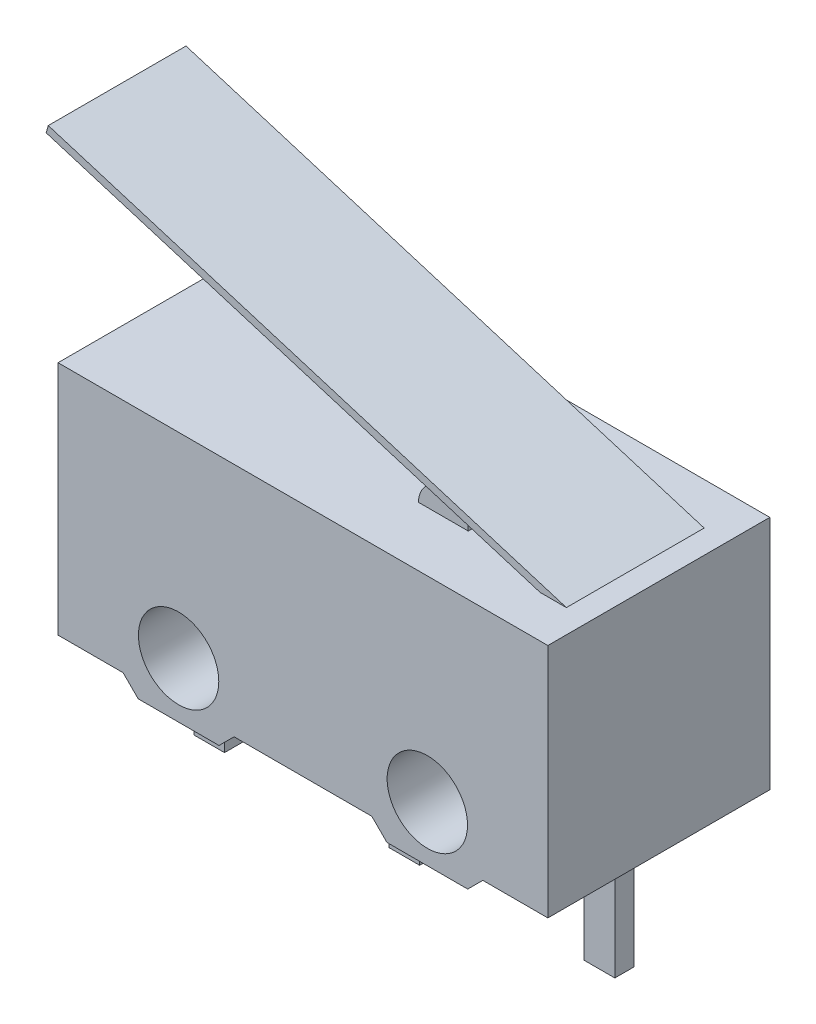
ISO-10303-21;
HEADER;
FILE_DESCRIPTION(('STEP AP214'),'2;1');
FILE_NAME('part.step','',(''),(''),'','','');
FILE_SCHEMA(('AUTOMOTIVE_DESIGN { 1 0 10303 214 1 1 1 1 }'));
ENDSEC;
DATA;
#1=APPLICATION_CONTEXT('core data for automotive mechanical design processes');
#2=APPLICATION_PROTOCOL_DEFINITION('international standard','automotive_design',2000,#1);
#3=PRODUCT_CONTEXT('',#1,'mechanical');
#4=PRODUCT('Part','Part','',(#3));
#5=PRODUCT_RELATED_PRODUCT_CATEGORY('part','',(#4));
#6=PRODUCT_DEFINITION_FORMATION('','',#4);
#7=PRODUCT_DEFINITION_CONTEXT('part definition',#1,'design');
#8=PRODUCT_DEFINITION('design','',#6,#7);
#9=PRODUCT_DEFINITION_SHAPE('','',#8);
#10=(LENGTH_UNIT() NAMED_UNIT(*) SI_UNIT(.MILLI.,.METRE.));
#11=(NAMED_UNIT(*) PLANE_ANGLE_UNIT() SI_UNIT($,.RADIAN.));
#12=(NAMED_UNIT(*) SI_UNIT($,.STERADIAN.) SOLID_ANGLE_UNIT());
#13=UNCERTAINTY_MEASURE_WITH_UNIT(LENGTH_MEASURE(1.E-05),#10,'distance_accuracy_value','');
#14=(GEOMETRIC_REPRESENTATION_CONTEXT(3) GLOBAL_UNCERTAINTY_ASSIGNED_CONTEXT((#13)) GLOBAL_UNIT_ASSIGNED_CONTEXT((#10,
#11,#12)) REPRESENTATION_CONTEXT('',''));
#15=CARTESIAN_POINT('',(0.,0.,0.));
#16=DIRECTION('',(0.,0.,1.));
#17=DIRECTION('',(1.,0.,0.));
#18=AXIS2_PLACEMENT_3D('',#15,#16,#17);
#19=CARTESIAN_POINT('',(0.,6.16570318150763,2.9));
#20=DIRECTION('',(0.,1.,0.));
#21=DIRECTION('',(0.,0.,1.));
#22=AXIS2_PLACEMENT_3D('',#19,#20,#21);
#23=PLANE('',#22);
#24=DIRECTION('',(1.,0.,0.));
#25=VECTOR('',#24,1.);
#26=CARTESIAN_POINT('',(1.47,6.16570318150763,1.35));
#27=LINE('',#26,#25);
#28=CARTESIAN_POINT('',(1.47,6.16570318150763,1.35));
#29=VERTEX_POINT('',#28);
#30=CARTESIAN_POINT('',(2.77,6.16570318150763,1.35));
#31=VERTEX_POINT('',#30);
#32=EDGE_CURVE('E419',#29,#31,#27,.T.);
#33=ORIENTED_EDGE('',*,*,#32,.F.);
#34=DIRECTION('',(0.,0.,-1.));
#35=VECTOR('',#34,1.);
#36=CARTESIAN_POINT('',(1.47,6.16570318150763,1.35));
#37=LINE('',#36,#35);
#38=CARTESIAN_POINT('',(1.47,6.16570318150763,-1.35));
#39=VERTEX_POINT('',#38);
#40=EDGE_CURVE('E433',#29,#39,#37,.T.);
#41=ORIENTED_EDGE('',*,*,#40,.T.);
#42=DIRECTION('',(1.,0.,0.));
#43=VECTOR('',#42,1.);
#44=CARTESIAN_POINT('',(1.47,6.16570318150763,-1.35));
#45=LINE('',#44,#43);
#46=CARTESIAN_POINT('',(2.77,6.16570318150763,-1.35));
#47=VERTEX_POINT('',#46);
#48=EDGE_CURVE('E420',#39,#47,#45,.T.);
#49=ORIENTED_EDGE('',*,*,#48,.T.);
#50=DIRECTION('',(0.,0.,-1.));
#51=VECTOR('',#50,1.);
#52=CARTESIAN_POINT('',(2.77,6.16570318150763,1.35));
#53=LINE('',#52,#51);
#54=EDGE_CURVE('E423',#31,#47,#53,.T.);
#55=ORIENTED_EDGE('',*,*,#54,.F.);
#56=EDGE_LOOP('',(#33,#41,#49,#55));
#57=FACE_BOUND('',#56,.T.);
#58=DIRECTION('',(1.,0.,0.));
#59=VECTOR('',#58,1.);
#60=CARTESIAN_POINT('',(0.,6.16570318150763,-2.9));
#61=LINE('',#60,#59);
#62=CARTESIAN_POINT('',(-6.4,6.16570318150763,-2.9));
#63=VERTEX_POINT('',#62);
#64=CARTESIAN_POINT('',(6.4,6.16570318150763,-2.9));
#65=VERTEX_POINT('',#64);
#66=EDGE_CURVE('E511',#63,#65,#61,.T.);
#67=ORIENTED_EDGE('',*,*,#66,.F.);
#68=DIRECTION('',(0.,0.,-1.));
#69=VECTOR('',#68,1.);
#70=CARTESIAN_POINT('',(-6.4,6.16570318150763,2.9));
#71=LINE('',#70,#69);
#72=CARTESIAN_POINT('',(-6.4,6.16570318150763,2.9));
#73=VERTEX_POINT('',#72);
#74=EDGE_CURVE('E558',#73,#63,#71,.T.);
#75=ORIENTED_EDGE('',*,*,#74,.F.);
#76=DIRECTION('',(1.,0.,0.));
#77=VECTOR('',#76,1.);
#78=CARTESIAN_POINT('',(0.,6.16570318150763,2.9));
#79=LINE('',#78,#77);
#80=CARTESIAN_POINT('',(6.4,6.16570318150763,2.9));
#81=VERTEX_POINT('',#80);
#82=EDGE_CURVE('E458',#73,#81,#79,.T.);
#83=ORIENTED_EDGE('',*,*,#82,.T.);
#84=DIRECTION('',(0.,0.,-1.));
#85=VECTOR('',#84,1.);
#86=CARTESIAN_POINT('',(6.4,6.16570318150763,2.9));
#87=LINE('',#86,#85);
#88=EDGE_CURVE('E561',#81,#65,#87,.T.);
#89=ORIENTED_EDGE('',*,*,#88,.T.);
#90=EDGE_LOOP('',(#67,#75,#83,#89));
#91=FACE_BOUND('',#90,.T.);
#92=DIRECTION('',(0.,0.,-1.));
#93=VECTOR('',#92,1.);
#94=CARTESIAN_POINT('',(5.78406072396667,6.16570318150763,1.8));
#95=LINE('',#94,#93);
#96=CARTESIAN_POINT('',(5.78406072396667,6.16570318150763,1.8));
#97=VERTEX_POINT('',#96);
#98=CARTESIAN_POINT('',(5.78406072396667,6.16570318150763,-1.8));
#99=VERTEX_POINT('',#98);
#100=EDGE_CURVE('E66',#97,#99,#95,.T.);
#101=ORIENTED_EDGE('',*,*,#100,.F.);
#102=DIRECTION('',(1.,0.,0.));
#103=VECTOR('',#102,1.);
#104=CARTESIAN_POINT('',(5.1,6.16570318150763,1.8));
#105=LINE('',#104,#103);
#106=CARTESIAN_POINT('',(5.1,6.16570318150763,1.8));
#107=VERTEX_POINT('',#106);
#108=EDGE_CURVE('E61',#107,#97,#105,.T.);
#109=ORIENTED_EDGE('',*,*,#108,.F.);
#110=DIRECTION('',(0.,0.,-1.));
#111=VECTOR('',#110,1.);
#112=CARTESIAN_POINT('',(5.1,6.16570318150763,1.8));
#113=LINE('',#112,#111);
#114=CARTESIAN_POINT('',(5.1,6.16570318150763,-1.8));
#115=VERTEX_POINT('',#114);
#116=EDGE_CURVE('E263',#107,#115,#113,.T.);
#117=ORIENTED_EDGE('',*,*,#116,.T.);
#118=DIRECTION('',(1.,0.,0.));
#119=VECTOR('',#118,1.);
#120=CARTESIAN_POINT('',(5.1,6.16570318150763,-1.8));
#121=LINE('',#120,#119);
#122=EDGE_CURVE('E265',#115,#99,#121,.T.);
#123=ORIENTED_EDGE('',*,*,#122,.T.);
#124=EDGE_LOOP('',(#101,#109,#117,#123));
#125=FACE_BOUND('',#124,.T.);
#126=ADVANCED_FACE('F45',(#57,#91,#125),#23,.T.);
#127=CARTESIAN_POINT('',(0.,0.,2.9));
#128=DIRECTION('',(0.,-1.,0.));
#129=DIRECTION('',(1.,0.,0.));
#130=AXIS2_PLACEMENT_3D('',#127,#128,#129);
#131=PLANE('',#130);
#132=DIRECTION('',(0.,0.,-1.));
#133=VECTOR('',#132,1.);
#134=CARTESIAN_POINT('',(-5.5,0.,0.25));
#135=LINE('',#134,#133);
#136=CARTESIAN_POINT('',(-5.5,0.,0.25));
#137=VERTEX_POINT('',#136);
#138=CARTESIAN_POINT('',(-5.5,0.,-0.25));
#139=VERTEX_POINT('',#138);
#140=EDGE_CURVE('E293',#137,#139,#135,.T.);
#141=ORIENTED_EDGE('',*,*,#140,.F.);
#142=DIRECTION('',(-1.,0.,0.));
#143=VECTOR('',#142,1.);
#144=CARTESIAN_POINT('',(-5.5,0.,0.25));
#145=LINE('',#144,#143);
#146=CARTESIAN_POINT('',(-4.7,0.,0.25));
#147=VERTEX_POINT('',#146);
#148=EDGE_CURVE('E325',#147,#137,#145,.T.);
#149=ORIENTED_EDGE('',*,*,#148,.F.);
#150=DIRECTION('',(0.,0.,-1.));
#151=VECTOR('',#150,1.);
#152=CARTESIAN_POINT('',(-4.7,0.,2.9));
#153=LINE('',#152,#151);
#154=CARTESIAN_POINT('',(-4.7,0.,2.9));
#155=VERTEX_POINT('',#154);
#156=EDGE_CURVE('E551',#155,#147,#153,.T.);
#157=ORIENTED_EDGE('',*,*,#156,.F.);
#158=DIRECTION('',(-1.,0.,0.));
#159=VECTOR('',#158,1.);
#160=CARTESIAN_POINT('',(0.,0.,2.9));
#161=LINE('',#160,#159);
#162=CARTESIAN_POINT('',(-6.4,0.,2.9));
#163=VERTEX_POINT('',#162);
#164=EDGE_CURVE('E466',#155,#163,#161,.T.);
#165=ORIENTED_EDGE('',*,*,#164,.T.);
#166=DIRECTION('',(0.,0.,-1.));
#167=VECTOR('',#166,1.);
#168=CARTESIAN_POINT('',(-6.4,0.,2.9));
#169=LINE('',#168,#167);
#170=CARTESIAN_POINT('',(-6.4,0.,-2.9));
#171=VERTEX_POINT('',#170);
#172=EDGE_CURVE('E555',#163,#171,#169,.T.);
#173=ORIENTED_EDGE('',*,*,#172,.T.);
#174=DIRECTION('',(-1.,0.,0.));
#175=VECTOR('',#174,1.);
#176=CARTESIAN_POINT('',(0.,0.,-2.9));
#177=LINE('',#176,#175);
#178=CARTESIAN_POINT('',(-4.7,0.,-2.9));
#179=VERTEX_POINT('',#178);
#180=EDGE_CURVE('E519',#179,#171,#177,.T.);
#181=ORIENTED_EDGE('',*,*,#180,.F.);
#182=CARTESIAN_POINT('',(-4.7,0.,-0.25));
#183=VERTEX_POINT('',#182);
#184=EDGE_CURVE('E550',#183,#179,#153,.T.);
#185=ORIENTED_EDGE('',*,*,#184,.F.);
#186=DIRECTION('',(-1.,0.,0.));
#187=VECTOR('',#186,1.);
#188=CARTESIAN_POINT('',(-5.5,0.,-0.25));
#189=LINE('',#188,#187);
#190=EDGE_CURVE('E312',#183,#139,#189,.T.);
#191=ORIENTED_EDGE('',*,*,#190,.T.);
#192=EDGE_LOOP('',(#141,#149,#157,#165,#173,#181,#185,#191));
#193=FACE_BOUND('',#192,.T.);
#194=ADVANCED_FACE('F626',(#193),#131,.T.);
#195=CARTESIAN_POINT('',(0.,0.,2.9));
#196=DIRECTION('',(0.,-1.,0.));
#197=DIRECTION('',(0.,0.,-1.));
#198=AXIS2_PLACEMENT_3D('',#195,#196,#197);
#199=PLANE('',#198);
#200=DIRECTION('',(-1.,0.,0.));
#201=VECTOR('',#200,1.);
#202=CARTESIAN_POINT('',(0.,0.,-2.9));
#203=LINE('',#202,#201);
#204=CARTESIAN_POINT('',(1.8,0.,-2.9));
#205=VERTEX_POINT('',#204);
#206=CARTESIAN_POINT('',(-1.8,0.,-2.9));
#207=VERTEX_POINT('',#206);
#208=EDGE_CURVE('E437',#205,#207,#203,.T.);
#209=ORIENTED_EDGE('',*,*,#208,.F.);
#210=DIRECTION('',(0.,0.,-1.));
#211=VECTOR('',#210,1.);
#212=CARTESIAN_POINT('',(1.8,0.,2.9));
#213=LINE('',#212,#211);
#214=CARTESIAN_POINT('',(1.8,0.,2.9));
#215=VERTEX_POINT('',#214);
#216=EDGE_CURVE('E11',#215,#205,#213,.T.);
#217=ORIENTED_EDGE('',*,*,#216,.F.);
#218=DIRECTION('',(-1.,0.,0.));
#219=VECTOR('',#218,1.);
#220=CARTESIAN_POINT('',(0.,0.,2.9));
#221=LINE('',#220,#219);
#222=CARTESIAN_POINT('',(-1.8,0.,2.9));
#223=VERTEX_POINT('',#222);
#224=EDGE_CURVE('E438',#215,#223,#221,.T.);
#225=ORIENTED_EDGE('',*,*,#224,.T.);
#226=DIRECTION('',(0.,0.,-1.));
#227=VECTOR('',#226,1.);
#228=CARTESIAN_POINT('',(-1.8,0.,2.9));
#229=LINE('',#228,#227);
#230=EDGE_CURVE('E490',#223,#207,#229,.T.);
#231=ORIENTED_EDGE('',*,*,#230,.T.);
#232=EDGE_LOOP('',(#209,#217,#225,#231));
#233=FACE_BOUND('',#232,.T.);
#234=DIRECTION('',(0.,0.,-1.));
#235=VECTOR('',#234,1.);
#236=CARTESIAN_POINT('',(-0.4,0.,0.25));
#237=LINE('',#236,#235);
#238=CARTESIAN_POINT('',(-0.4,0.,0.25));
#239=VERTEX_POINT('',#238);
#240=CARTESIAN_POINT('',(-0.4,0.,-0.25));
#241=VERTEX_POINT('',#240);
#242=EDGE_CURVE('E319',#239,#241,#237,.T.);
#243=ORIENTED_EDGE('',*,*,#242,.F.);
#244=DIRECTION('',(-1.,0.,0.));
#245=VECTOR('',#244,1.);
#246=CARTESIAN_POINT('',(-0.4,0.,0.25));
#247=LINE('',#246,#245);
#248=CARTESIAN_POINT('',(0.4,0.,0.25));
#249=VERTEX_POINT('',#248);
#250=EDGE_CURVE('E350',#249,#239,#247,.T.);
#251=ORIENTED_EDGE('',*,*,#250,.F.);
#252=DIRECTION('',(0.,0.,-1.));
#253=VECTOR('',#252,1.);
#254=CARTESIAN_POINT('',(0.4,0.,0.25));
#255=LINE('',#254,#253);
#256=CARTESIAN_POINT('',(0.4,0.,-0.25));
#257=VERTEX_POINT('',#256);
#258=EDGE_CURVE('E341',#249,#257,#255,.T.);
#259=ORIENTED_EDGE('',*,*,#258,.T.);
#260=DIRECTION('',(-1.,0.,0.));
#261=VECTOR('',#260,1.);
#262=CARTESIAN_POINT('',(-0.4,0.,-0.25));
#263=LINE('',#262,#261);
#264=EDGE_CURVE('E356',#257,#241,#263,.T.);
#265=ORIENTED_EDGE('',*,*,#264,.T.);
#266=EDGE_LOOP('',(#243,#251,#259,#265));
#267=FACE_BOUND('',#266,.T.);
#268=ADVANCED_FACE('F47',(#233,#267),#199,.T.);
#269=CARTESIAN_POINT('',(0.900000000000015,0.9,2.9));
#270=DIRECTION('',(0.707106781186553,0.707106781186542,0.));
#271=DIRECTION('',(-0.707106781186542,0.707106781186553,0.));
#272=AXIS2_PLACEMENT_3D('',#269,#270,#271);
#273=PLANE('',#272);
#274=DIRECTION('',(0.707106781186542,-0.707106781186553,0.));
#275=VECTOR('',#274,1.);
#276=CARTESIAN_POINT('',(0.900000000000015,0.9,-2.9));
#277=LINE('',#276,#275);
#278=CARTESIAN_POINT('',(2.19429681849237,-0.394296818492372,-2.9));
#279=VERTEX_POINT('',#278);
#280=EDGE_CURVE('E494',#205,#279,#277,.T.);
#281=ORIENTED_EDGE('',*,*,#280,.T.);
#282=DIRECTION('',(0.,0.,-1.));
#283=VECTOR('',#282,1.);
#284=CARTESIAN_POINT('',(2.19429681849237,-0.394296818492372,2.9));
#285=LINE('',#284,#283);
#286=CARTESIAN_POINT('',(2.19429681849237,-0.394296818492372,2.9));
#287=VERTEX_POINT('',#286);
#288=EDGE_CURVE('E54',#287,#279,#285,.T.);
#289=ORIENTED_EDGE('',*,*,#288,.F.);
#290=DIRECTION('',(0.707106781186542,-0.707106781186553,0.));
#291=VECTOR('',#290,1.);
#292=CARTESIAN_POINT('',(0.900000000000015,0.9,2.9));
#293=LINE('',#292,#291);
#294=EDGE_CURVE('E442',#215,#287,#293,.T.);
#295=ORIENTED_EDGE('',*,*,#294,.F.);
#296=ORIENTED_EDGE('',*,*,#216,.T.);
#297=EDGE_LOOP('',(#281,#289,#295,#296));
#298=FACE_BOUND('',#297,.T.);
#299=ADVANCED_FACE('F606',(#298),#273,.F.);
#300=CARTESIAN_POINT('',(0.,-0.394296818492372,2.9));
#301=DIRECTION('',(0.,1.,0.));
#302=DIRECTION('',(0.,0.,1.));
#303=AXIS2_PLACEMENT_3D('',#300,#301,#302);
#304=PLANE('',#303);
#305=DIRECTION('',(1.,0.,0.));
#306=VECTOR('',#305,1.);
#307=CARTESIAN_POINT('',(0.,-0.394296818492372,-2.9));
#308=LINE('',#307,#306);
#309=CARTESIAN_POINT('',(4.30570318150763,-0.394296818492371,-2.9));
#310=VERTEX_POINT('',#309);
#311=EDGE_CURVE('E497',#279,#310,#308,.T.);
#312=ORIENTED_EDGE('',*,*,#311,.T.);
#313=DIRECTION('',(0.,0.,-1.));
#314=VECTOR('',#313,1.);
#315=CARTESIAN_POINT('',(4.30570318150763,-0.394296818492371,2.9));
#316=LINE('',#315,#314);
#317=CARTESIAN_POINT('',(4.30570318150763,-0.394296818492371,2.9));
#318=VERTEX_POINT('',#317);
#319=EDGE_CURVE('E573',#318,#310,#316,.T.);
#320=ORIENTED_EDGE('',*,*,#319,.F.);
#321=DIRECTION('',(1.,0.,0.));
#322=VECTOR('',#321,1.);
#323=CARTESIAN_POINT('',(0.,-0.394296818492372,2.9));
#324=LINE('',#323,#322);
#325=EDGE_CURVE('E446',#287,#318,#324,.T.);
#326=ORIENTED_EDGE('',*,*,#325,.F.);
#327=ORIENTED_EDGE('',*,*,#288,.T.);
#328=EDGE_LOOP('',(#312,#320,#326,#327));
#329=FACE_BOUND('',#328,.T.);
#330=ADVANCED_FACE('F582',(#329),#304,.F.);
#331=CARTESIAN_POINT('',(2.35000000000004,-2.35,2.9));
#332=DIRECTION('',(-0.707106781186553,0.707106781186542,0.));
#333=DIRECTION('',(-0.707106781186542,-0.707106781186553,0.));
#334=AXIS2_PLACEMENT_3D('',#331,#332,#333);
#335=PLANE('',#334);
#336=DIRECTION('',(0.707106781186542,0.707106781186553,0.));
#337=VECTOR('',#336,1.);
#338=CARTESIAN_POINT('',(2.35000000000004,-2.35,-2.9));
#339=LINE('',#338,#337);
#340=CARTESIAN_POINT('',(4.7,0.,-2.9));
#341=VERTEX_POINT('',#340);
#342=EDGE_CURVE('E500',#310,#341,#339,.T.);
#343=ORIENTED_EDGE('',*,*,#342,.T.);
#344=DIRECTION('',(0.,0.,-1.));
#345=VECTOR('',#344,1.);
#346=CARTESIAN_POINT('',(4.7,0.,2.9));
#347=LINE('',#346,#345);
#348=CARTESIAN_POINT('',(4.7,0.,-0.25));
#349=VERTEX_POINT('',#348);
#350=EDGE_CURVE('E568',#349,#341,#347,.T.);
#351=ORIENTED_EDGE('',*,*,#350,.F.);
#352=DIRECTION('',(0.,0.,-1.));
#353=VECTOR('',#352,1.);
#354=CARTESIAN_POINT('',(4.7,0.,0.25));
#355=LINE('',#354,#353);
#356=CARTESIAN_POINT('',(4.7,0.,0.25));
#357=VERTEX_POINT('',#356);
#358=EDGE_CURVE('E388',#357,#349,#355,.T.);
#359=ORIENTED_EDGE('',*,*,#358,.F.);
#360=CARTESIAN_POINT('',(4.7,0.,2.9));
#361=VERTEX_POINT('',#360);
#362=EDGE_CURVE('E569',#361,#357,#347,.T.);
#363=ORIENTED_EDGE('',*,*,#362,.F.);
#364=DIRECTION('',(0.707106781186542,0.707106781186553,0.));
#365=VECTOR('',#364,1.);
#366=CARTESIAN_POINT('',(2.35000000000004,-2.35,2.9));
#367=LINE('',#366,#365);
#368=EDGE_CURVE('E449',#318,#361,#367,.T.);
#369=ORIENTED_EDGE('',*,*,#368,.F.);
#370=ORIENTED_EDGE('',*,*,#319,.T.);
#371=EDGE_LOOP('',(#343,#351,#359,#363,#369,#370));
#372=FACE_BOUND('',#371,.T.);
#373=ADVANCED_FACE('F596',(#372),#335,.F.);
#374=CARTESIAN_POINT('',(0.,0.,2.9));
#375=DIRECTION('',(0.,1.,0.));
#376=DIRECTION('',(-1.,0.,0.));
#377=AXIS2_PLACEMENT_3D('',#374,#375,#376);
#378=PLANE('',#377);
#379=ORIENTED_EDGE('',*,*,#362,.T.);
#380=DIRECTION('',(-1.,0.,0.));
#381=VECTOR('',#380,1.);
#382=CARTESIAN_POINT('',(4.7,0.,0.25));
#383=LINE('',#382,#381);
#384=CARTESIAN_POINT('',(5.5,0.,0.25));
#385=VERTEX_POINT('',#384);
#386=EDGE_CURVE('E384',#385,#357,#383,.T.);
#387=ORIENTED_EDGE('',*,*,#386,.F.);
#388=DIRECTION('',(0.,0.,-1.));
#389=VECTOR('',#388,1.);
#390=CARTESIAN_POINT('',(5.5,0.,0.25));
#391=LINE('',#390,#389);
#392=CARTESIAN_POINT('',(5.5,0.,-0.25));
#393=VERTEX_POINT('',#392);
#394=EDGE_CURVE('E404',#385,#393,#391,.T.);
#395=ORIENTED_EDGE('',*,*,#394,.T.);
#396=DIRECTION('',(-1.,0.,0.));
#397=VECTOR('',#396,1.);
#398=CARTESIAN_POINT('',(4.7,0.,-0.25));
#399=LINE('',#398,#397);
#400=EDGE_CURVE('E377',#393,#349,#399,.T.);
#401=ORIENTED_EDGE('',*,*,#400,.T.);
#402=ORIENTED_EDGE('',*,*,#350,.T.);
#403=DIRECTION('',(1.,0.,0.));
#404=VECTOR('',#403,1.);
#405=CARTESIAN_POINT('',(0.,0.,-2.9));
#406=LINE('',#405,#404);
#407=CARTESIAN_POINT('',(6.4,0.,-2.9));
#408=VERTEX_POINT('',#407);
#409=EDGE_CURVE('E504',#341,#408,#406,.T.);
#410=ORIENTED_EDGE('',*,*,#409,.T.);
#411=DIRECTION('',(0.,0.,-1.));
#412=VECTOR('',#411,1.);
#413=CARTESIAN_POINT('',(6.4,0.,2.9));
#414=LINE('',#413,#412);
#415=CARTESIAN_POINT('',(6.4,0.,2.9));
#416=VERTEX_POINT('',#415);
#417=EDGE_CURVE('E564',#416,#408,#414,.T.);
#418=ORIENTED_EDGE('',*,*,#417,.F.);
#419=DIRECTION('',(1.,0.,0.));
#420=VECTOR('',#419,1.);
#421=CARTESIAN_POINT('',(0.,0.,2.9));
#422=LINE('',#421,#420);
#423=EDGE_CURVE('E452',#361,#416,#422,.T.);
#424=ORIENTED_EDGE('',*,*,#423,.F.);
#425=EDGE_LOOP('',(#379,#387,#395,#401,#402,#410,#418,#424));
#426=FACE_BOUND('',#425,.T.);
#427=ADVANCED_FACE('F640',(#426),#378,.F.);
#428=CARTESIAN_POINT('',(6.4,0.,2.9));
#429=DIRECTION('',(-1.,0.,0.));
#430=DIRECTION('',(0.,0.,1.));
#431=AXIS2_PLACEMENT_3D('',#428,#429,#430);
#432=PLANE('',#431);
#433=DIRECTION('',(0.,1.,0.));
#434=VECTOR('',#433,1.);
#435=CARTESIAN_POINT('',(6.4,0.,-2.9));
#436=LINE('',#435,#434);
#437=EDGE_CURVE('E507',#408,#65,#436,.T.);
#438=ORIENTED_EDGE('',*,*,#437,.T.);
#439=ORIENTED_EDGE('',*,*,#88,.F.);
#440=DIRECTION('',(0.,1.,0.));
#441=VECTOR('',#440,1.);
#442=CARTESIAN_POINT('',(6.4,0.,2.9));
#443=LINE('',#442,#441);
#444=EDGE_CURVE('E455',#416,#81,#443,.T.);
#445=ORIENTED_EDGE('',*,*,#444,.F.);
#446=ORIENTED_EDGE('',*,*,#417,.T.);
#447=EDGE_LOOP('',(#438,#439,#445,#446));
#448=FACE_BOUND('',#447,.T.);
#449=ADVANCED_FACE('F638',(#448),#432,.F.);
#450=CARTESIAN_POINT('',(-6.4,0.,2.9));
#451=DIRECTION('',(-1.,0.,0.));
#452=DIRECTION('',(0.,0.,1.));
#453=AXIS2_PLACEMENT_3D('',#450,#451,#452);
#454=PLANE('',#453);
#455=DIRECTION('',(0.,1.,0.));
#456=VECTOR('',#455,1.);
#457=CARTESIAN_POINT('',(-6.4,0.,-2.9));
#458=LINE('',#457,#456);
#459=EDGE_CURVE('E515',#171,#63,#458,.T.);
#460=ORIENTED_EDGE('',*,*,#459,.F.);
#461=ORIENTED_EDGE('',*,*,#172,.F.);
#462=DIRECTION('',(0.,1.,0.));
#463=VECTOR('',#462,1.);
#464=CARTESIAN_POINT('',(-6.4,0.,2.9));
#465=LINE('',#464,#463);
#466=EDGE_CURVE('E462',#163,#73,#465,.T.);
#467=ORIENTED_EDGE('',*,*,#466,.T.);
#468=ORIENTED_EDGE('',*,*,#74,.T.);
#469=EDGE_LOOP('',(#460,#461,#467,#468));
#470=FACE_BOUND('',#469,.T.);
#471=ADVANCED_FACE('F631',(#470),#454,.T.);
#472=CARTESIAN_POINT('',(-2.35000000000004,-2.35,2.9));
#473=DIRECTION('',(-0.707106781186553,-0.707106781186542,0.));
#474=DIRECTION('',(0.707106781186542,-0.707106781186553,0.));
#475=AXIS2_PLACEMENT_3D('',#472,#473,#474);
#476=PLANE('',#475);
#477=DIRECTION('',(-0.707106781186542,0.707106781186553,0.));
#478=VECTOR('',#477,1.);
#479=CARTESIAN_POINT('',(-2.35000000000004,-2.35,-2.9));
#480=LINE('',#479,#478);
#481=CARTESIAN_POINT('',(-4.30570318150763,-0.394296818492372,-2.9));
#482=VERTEX_POINT('',#481);
#483=EDGE_CURVE('E523',#482,#179,#480,.T.);
#484=ORIENTED_EDGE('',*,*,#483,.F.);
#485=DIRECTION('',(0.,0.,-1.));
#486=VECTOR('',#485,1.);
#487=CARTESIAN_POINT('',(-4.30570318150763,-0.394296818492372,2.9));
#488=LINE('',#487,#486);
#489=CARTESIAN_POINT('',(-4.30570318150763,-0.394296818492372,2.9));
#490=VERTEX_POINT('',#489);
#491=EDGE_CURVE('E547',#490,#482,#488,.T.);
#492=ORIENTED_EDGE('',*,*,#491,.F.);
#493=DIRECTION('',(-0.707106781186542,0.707106781186553,0.));
#494=VECTOR('',#493,1.);
#495=CARTESIAN_POINT('',(-2.35000000000004,-2.35,2.9));
#496=LINE('',#495,#494);
#497=EDGE_CURVE('E470',#490,#155,#496,.T.);
#498=ORIENTED_EDGE('',*,*,#497,.T.);
#499=ORIENTED_EDGE('',*,*,#156,.T.);
#500=DIRECTION('',(0.,0.,-1.));
#501=VECTOR('',#500,1.);
#502=CARTESIAN_POINT('',(-4.7,0.,0.25));
#503=LINE('',#502,#501);
#504=EDGE_CURVE('E285',#147,#183,#503,.T.);
#505=ORIENTED_EDGE('',*,*,#504,.T.);
#506=ORIENTED_EDGE('',*,*,#184,.T.);
#507=EDGE_LOOP('',(#484,#492,#498,#499,#505,#506));
#508=FACE_BOUND('',#507,.T.);
#509=ADVANCED_FACE('F619',(#508),#476,.T.);
#510=CARTESIAN_POINT('',(0.,-0.394296818492372,2.9));
#511=DIRECTION('',(0.,-1.,0.));
#512=DIRECTION('',(0.,0.,-1.));
#513=AXIS2_PLACEMENT_3D('',#510,#511,#512);
#514=PLANE('',#513);
#515=DIRECTION('',(-1.,0.,0.));
#516=VECTOR('',#515,1.);
#517=CARTESIAN_POINT('',(0.,-0.394296818492372,-2.9));
#518=LINE('',#517,#516);
#519=CARTESIAN_POINT('',(-2.19429681849237,-0.394296818492372,-2.9));
#520=VERTEX_POINT('',#519);
#521=EDGE_CURVE('E527',#520,#482,#518,.T.);
#522=ORIENTED_EDGE('',*,*,#521,.F.);
#523=DIRECTION('',(0.,0.,-1.));
#524=VECTOR('',#523,1.);
#525=CARTESIAN_POINT('',(-2.19429681849237,-0.394296818492372,2.9));
#526=LINE('',#525,#524);
#527=CARTESIAN_POINT('',(-2.19429681849237,-0.394296818492372,2.9));
#528=VERTEX_POINT('',#527);
#529=EDGE_CURVE('E544',#528,#520,#526,.T.);
#530=ORIENTED_EDGE('',*,*,#529,.F.);
#531=DIRECTION('',(-1.,0.,0.));
#532=VECTOR('',#531,1.);
#533=CARTESIAN_POINT('',(0.,-0.394296818492372,2.9));
#534=LINE('',#533,#532);
#535=EDGE_CURVE('E474',#528,#490,#534,.T.);
#536=ORIENTED_EDGE('',*,*,#535,.T.);
#537=ORIENTED_EDGE('',*,*,#491,.T.);
#538=EDGE_LOOP('',(#522,#530,#536,#537));
#539=FACE_BOUND('',#538,.T.);
#540=ADVANCED_FACE('F615',(#539),#514,.T.);
#541=CARTESIAN_POINT('',(-3.25,1.05,2.9));
#542=DIRECTION('',(0.,0.,-1.));
#543=DIRECTION('',(-1.,0.,0.));
#544=AXIS2_PLACEMENT_3D('',#541,#542,#543);
#545=CYLINDRICAL_SURFACE('',#544,1.05);
#546=CARTESIAN_POINT('',(-3.25,1.05,2.9));
#547=DIRECTION('',(0.,0.,1.));
#548=DIRECTION('',(1.,0.,0.));
#549=AXIS2_PLACEMENT_3D('',#546,#547,#548);
#550=CIRCLE('',#549,1.05);
#551=CARTESIAN_POINT('',(-2.2,1.05,2.9));
#552=VERTEX_POINT('',#551);
#553=EDGE_CURVE('E482',#552,#552,#550,.T.);
#554=ORIENTED_EDGE('',*,*,#553,.T.);
#555=EDGE_LOOP('',(#554));
#556=FACE_BOUND('',#555,.T.);
#557=CARTESIAN_POINT('',(-3.25,1.05,-2.9));
#558=DIRECTION('',(0.,0.,1.));
#559=DIRECTION('',(1.,0.,0.));
#560=AXIS2_PLACEMENT_3D('',#557,#558,#559);
#561=CIRCLE('',#560,1.05);
#562=CARTESIAN_POINT('',(-2.2,1.05,-2.9));
#563=VERTEX_POINT('',#562);
#564=EDGE_CURVE('E535',#563,#563,#561,.T.);
#565=ORIENTED_EDGE('',*,*,#564,.F.);
#566=EDGE_LOOP('',(#565));
#567=FACE_BOUND('',#566,.T.);
#568=ADVANCED_FACE('F769',(#556,#567),#545,.F.);
#569=CARTESIAN_POINT('',(-0.900000000000015,0.9,2.9));
#570=DIRECTION('',(0.707106781186553,-0.707106781186542,0.));
#571=DIRECTION('',(0.707106781186542,0.707106781186553,0.));
#572=AXIS2_PLACEMENT_3D('',#569,#570,#571);
#573=PLANE('',#572);
#574=DIRECTION('',(-0.707106781186542,-0.707106781186553,0.));
#575=VECTOR('',#574,1.);
#576=CARTESIAN_POINT('',(-0.900000000000015,0.9,-2.9));
#577=LINE('',#576,#575);
#578=EDGE_CURVE('E531',#207,#520,#577,.T.);
#579=ORIENTED_EDGE('',*,*,#578,.F.);
#580=ORIENTED_EDGE('',*,*,#230,.F.);
#581=DIRECTION('',(-0.707106781186542,-0.707106781186553,0.));
#582=VECTOR('',#581,1.);
#583=CARTESIAN_POINT('',(-0.900000000000015,0.9,2.9));
#584=LINE('',#583,#582);
#585=EDGE_CURVE('E478',#223,#528,#584,.T.);
#586=ORIENTED_EDGE('',*,*,#585,.T.);
#587=ORIENTED_EDGE('',*,*,#529,.T.);
#588=EDGE_LOOP('',(#579,#580,#586,#587));
#589=FACE_BOUND('',#588,.T.);
#590=ADVANCED_FACE('F611',(#589),#573,.T.);
#591=CARTESIAN_POINT('',(3.25,1.05,2.9));
#592=DIRECTION('',(0.,0.,-1.));
#593=DIRECTION('',(-1.,0.,0.));
#594=AXIS2_PLACEMENT_3D('',#591,#592,#593);
#595=CYLINDRICAL_SURFACE('',#594,1.05);
#596=CARTESIAN_POINT('',(3.25,1.05,2.9));
#597=DIRECTION('',(0.,0.,1.));
#598=DIRECTION('',(1.,0.,0.));
#599=AXIS2_PLACEMENT_3D('',#596,#597,#598);
#600=CIRCLE('',#599,1.05);
#601=CARTESIAN_POINT('',(4.3,1.05,2.9));
#602=VERTEX_POINT('',#601);
#603=EDGE_CURVE('E486',#602,#602,#600,.F.);
#604=ORIENTED_EDGE('',*,*,#603,.F.);
#605=EDGE_LOOP('',(#604));
#606=FACE_BOUND('',#605,.T.);
#607=CARTESIAN_POINT('',(3.25,1.05,-2.9));
#608=DIRECTION('',(0.,0.,1.));
#609=DIRECTION('',(1.,0.,0.));
#610=AXIS2_PLACEMENT_3D('',#607,#608,#609);
#611=CIRCLE('',#610,1.05);
#612=CARTESIAN_POINT('',(4.3,1.05,-2.9));
#613=VERTEX_POINT('',#612);
#614=EDGE_CURVE('E443',#613,#613,#611,.F.);
#615=ORIENTED_EDGE('',*,*,#614,.T.);
#616=EDGE_LOOP('',(#615));
#617=FACE_BOUND('',#616,.T.);
#618=ADVANCED_FACE('F749',(#606,#617),#595,.F.);
#619=CARTESIAN_POINT('',(0.,0.,2.9));
#620=DIRECTION('',(0.,0.,1.));
#621=DIRECTION('',(1.,0.,0.));
#622=AXIS2_PLACEMENT_3D('',#619,#620,#621);
#623=PLANE('',#622);
#624=ORIENTED_EDGE('',*,*,#224,.F.);
#625=ORIENTED_EDGE('',*,*,#294,.T.);
#626=ORIENTED_EDGE('',*,*,#325,.T.);
#627=ORIENTED_EDGE('',*,*,#368,.T.);
#628=ORIENTED_EDGE('',*,*,#423,.T.);
#629=ORIENTED_EDGE('',*,*,#444,.T.);
#630=ORIENTED_EDGE('',*,*,#82,.F.);
#631=ORIENTED_EDGE('',*,*,#466,.F.);
#632=ORIENTED_EDGE('',*,*,#164,.F.);
#633=ORIENTED_EDGE('',*,*,#497,.F.);
#634=ORIENTED_EDGE('',*,*,#535,.F.);
#635=ORIENTED_EDGE('',*,*,#585,.F.);
#636=EDGE_LOOP('',(#624,#625,#626,#627,#628,#629,#630,#631,#632,#633,#634,#635));
#637=FACE_BOUND('',#636,.T.);
#638=ORIENTED_EDGE('',*,*,#553,.F.);
#639=EDGE_LOOP('',(#638));
#640=FACE_BOUND('',#639,.T.);
#641=ORIENTED_EDGE('',*,*,#603,.T.);
#642=EDGE_LOOP('',(#641));
#643=FACE_BOUND('',#642,.T.);
#644=ADVANCED_FACE('F602',(#637,#640,#643),#623,.T.);
#645=CARTESIAN_POINT('',(0.,0.,-2.9));
#646=DIRECTION('',(0.,0.,1.));
#647=DIRECTION('',(1.,0.,0.));
#648=AXIS2_PLACEMENT_3D('',#645,#646,#647);
#649=PLANE('',#648);
#650=ORIENTED_EDGE('',*,*,#208,.T.);
#651=ORIENTED_EDGE('',*,*,#578,.T.);
#652=ORIENTED_EDGE('',*,*,#521,.T.);
#653=ORIENTED_EDGE('',*,*,#483,.T.);
#654=ORIENTED_EDGE('',*,*,#180,.T.);
#655=ORIENTED_EDGE('',*,*,#459,.T.);
#656=ORIENTED_EDGE('',*,*,#66,.T.);
#657=ORIENTED_EDGE('',*,*,#437,.F.);
#658=ORIENTED_EDGE('',*,*,#409,.F.);
#659=ORIENTED_EDGE('',*,*,#342,.F.);
#660=ORIENTED_EDGE('',*,*,#311,.F.);
#661=ORIENTED_EDGE('',*,*,#280,.F.);
#662=EDGE_LOOP('',(#650,#651,#652,#653,#654,#655,#656,#657,#658,#659,#660,#661));
#663=FACE_BOUND('',#662,.T.);
#664=ORIENTED_EDGE('',*,*,#564,.T.);
#665=EDGE_LOOP('',(#664));
#666=FACE_BOUND('',#665,.T.);
#667=ORIENTED_EDGE('',*,*,#614,.F.);
#668=EDGE_LOOP('',(#667));
#669=FACE_BOUND('',#668,.T.);
#670=ADVANCED_FACE('F589',(#663,#666,#669),#649,.F.);
#671=CARTESIAN_POINT('',(2.12,6.16570318150763,1.35));
#672=DIRECTION('',(0.,0.,-1.));
#673=DIRECTION('',(-1.,0.,0.));
#674=AXIS2_PLACEMENT_3D('',#671,#672,#673);
#675=CYLINDRICAL_SURFACE('',#674,0.65);
#676=CARTESIAN_POINT('',(2.12,6.16570318150763,-1.35));
#677=DIRECTION('',(0.,0.,1.));
#678=DIRECTION('',(1.,0.,0.));
#679=AXIS2_PLACEMENT_3D('',#676,#677,#678);
#680=CIRCLE('',#679,0.65);
#681=EDGE_CURVE('E415',#47,#39,#680,.T.);
#682=ORIENTED_EDGE('',*,*,#681,.T.);
#683=ORIENTED_EDGE('',*,*,#40,.F.);
#684=CARTESIAN_POINT('',(2.12,6.16570318150763,1.35));
#685=DIRECTION('',(0.,0.,1.));
#686=DIRECTION('',(1.,0.,0.));
#687=AXIS2_PLACEMENT_3D('',#684,#685,#686);
#688=CIRCLE('',#687,0.65);
#689=EDGE_CURVE('E416',#31,#29,#688,.T.);
#690=ORIENTED_EDGE('',*,*,#689,.F.);
#691=ORIENTED_EDGE('',*,*,#54,.T.);
#692=EDGE_LOOP('',(#682,#683,#690,#691));
#693=FACE_BOUND('',#692,.T.);
#694=ADVANCED_FACE('F719',(#693),#675,.T.);
#695=CARTESIAN_POINT('',(2.12,6.16570318150763,1.35));
#696=DIRECTION('',(0.,0.,1.));
#697=DIRECTION('',(1.,0.,0.));
#698=AXIS2_PLACEMENT_3D('',#695,#696,#697);
#699=PLANE('',#698);
#700=ORIENTED_EDGE('',*,*,#689,.T.);
#701=ORIENTED_EDGE('',*,*,#32,.T.);
#702=EDGE_LOOP('',(#700,#701));
#703=FACE_BOUND('',#702,.T.);
#704=ADVANCED_FACE('F707',(#703),#699,.T.);
#705=CARTESIAN_POINT('',(2.12,6.16570318150763,-1.35));
#706=DIRECTION('',(0.,0.,1.));
#707=DIRECTION('',(1.,0.,0.));
#708=AXIS2_PLACEMENT_3D('',#705,#706,#707);
#709=PLANE('',#708);
#710=ORIENTED_EDGE('',*,*,#681,.F.);
#711=ORIENTED_EDGE('',*,*,#48,.F.);
#712=EDGE_LOOP('',(#710,#711));
#713=FACE_BOUND('',#712,.T.);
#714=ADVANCED_FACE('F667',(#713),#709,.F.);
#715=CARTESIAN_POINT('',(4.7,0.,0.25));
#716=DIRECTION('',(1.,0.,0.));
#717=DIRECTION('',(0.,0.,-1.));
#718=AXIS2_PLACEMENT_3D('',#715,#716,#717);
#719=PLANE('',#718);
#720=DIRECTION('',(0.,-1.,0.));
#721=VECTOR('',#720,1.);
#722=CARTESIAN_POINT('',(4.7,0.,-0.25));
#723=LINE('',#722,#721);
#724=CARTESIAN_POINT('',(4.7,-3.13429681849237,-0.25));
#725=VERTEX_POINT('',#724);
#726=EDGE_CURVE('E359',#349,#725,#723,.T.);
#727=ORIENTED_EDGE('',*,*,#726,.T.);
#728=DIRECTION('',(0.,0.,-1.));
#729=VECTOR('',#728,1.);
#730=CARTESIAN_POINT('',(4.7,-3.13429681849237,0.25));
#731=LINE('',#730,#729);
#732=CARTESIAN_POINT('',(4.7,-3.13429681849237,0.25));
#733=VERTEX_POINT('',#732);
#734=EDGE_CURVE('E411',#733,#725,#731,.T.);
#735=ORIENTED_EDGE('',*,*,#734,.F.);
#736=DIRECTION('',(0.,-1.,0.));
#737=VECTOR('',#736,1.);
#738=CARTESIAN_POINT('',(4.7,0.,0.25));
#739=LINE('',#738,#737);
#740=EDGE_CURVE('E372',#357,#733,#739,.T.);
#741=ORIENTED_EDGE('',*,*,#740,.F.);
#742=ORIENTED_EDGE('',*,*,#358,.T.);
#743=EDGE_LOOP('',(#727,#735,#741,#742));
#744=FACE_BOUND('',#743,.T.);
#745=ADVANCED_FACE('F650',(#744),#719,.F.);
#746=CARTESIAN_POINT('',(4.7,-3.13429681849237,0.25));
#747=DIRECTION('',(0.,1.,0.));
#748=DIRECTION('',(0.,0.,1.));
#749=AXIS2_PLACEMENT_3D('',#746,#747,#748);
#750=PLANE('',#749);
#751=DIRECTION('',(1.,0.,0.));
#752=VECTOR('',#751,1.);
#753=CARTESIAN_POINT('',(4.7,-3.13429681849237,-0.25));
#754=LINE('',#753,#752);
#755=CARTESIAN_POINT('',(5.5,-3.13429681849237,-0.25));
#756=VERTEX_POINT('',#755);
#757=EDGE_CURVE('E392',#725,#756,#754,.T.);
#758=ORIENTED_EDGE('',*,*,#757,.T.);
#759=DIRECTION('',(0.,0.,-1.));
#760=VECTOR('',#759,1.);
#761=CARTESIAN_POINT('',(5.5,-3.13429681849237,0.25));
#762=LINE('',#761,#760);
#763=CARTESIAN_POINT('',(5.5,-3.13429681849237,0.25));
#764=VERTEX_POINT('',#763);
#765=EDGE_CURVE('E407',#764,#756,#762,.T.);
#766=ORIENTED_EDGE('',*,*,#765,.F.);
#767=DIRECTION('',(1.,0.,0.));
#768=VECTOR('',#767,1.);
#769=CARTESIAN_POINT('',(4.7,-3.13429681849237,0.25));
#770=LINE('',#769,#768);
#771=EDGE_CURVE('E376',#733,#764,#770,.T.);
#772=ORIENTED_EDGE('',*,*,#771,.F.);
#773=ORIENTED_EDGE('',*,*,#734,.T.);
#774=EDGE_LOOP('',(#758,#766,#772,#773));
#775=FACE_BOUND('',#774,.T.);
#776=ADVANCED_FACE('F659',(#775),#750,.F.);
#777=CARTESIAN_POINT('',(5.5,-3.13429681849237,0.25));
#778=DIRECTION('',(-1.,0.,0.));
#779=DIRECTION('',(0.,0.,1.));
#780=AXIS2_PLACEMENT_3D('',#777,#778,#779);
#781=PLANE('',#780);
#782=DIRECTION('',(0.,1.,0.));
#783=VECTOR('',#782,1.);
#784=CARTESIAN_POINT('',(5.5,-3.13429681849237,-0.25));
#785=LINE('',#784,#783);
#786=EDGE_CURVE('E395',#756,#393,#785,.T.);
#787=ORIENTED_EDGE('',*,*,#786,.T.);
#788=ORIENTED_EDGE('',*,*,#394,.F.);
#789=DIRECTION('',(0.,1.,0.));
#790=VECTOR('',#789,1.);
#791=CARTESIAN_POINT('',(5.5,-3.13429681849237,0.25));
#792=LINE('',#791,#790);
#793=EDGE_CURVE('E380',#764,#385,#792,.T.);
#794=ORIENTED_EDGE('',*,*,#793,.F.);
#795=ORIENTED_EDGE('',*,*,#765,.T.);
#796=EDGE_LOOP('',(#787,#788,#794,#795));
#797=FACE_BOUND('',#796,.T.);
#798=ADVANCED_FACE('F657',(#797),#781,.F.);
#799=CARTESIAN_POINT('',(0.,0.,0.25));
#800=DIRECTION('',(0.,0.,1.));
#801=DIRECTION('',(1.,0.,0.));
#802=AXIS2_PLACEMENT_3D('',#799,#800,#801);
#803=PLANE('',#802);
#804=ORIENTED_EDGE('',*,*,#740,.T.);
#805=ORIENTED_EDGE('',*,*,#771,.T.);
#806=ORIENTED_EDGE('',*,*,#793,.T.);
#807=ORIENTED_EDGE('',*,*,#386,.T.);
#808=EDGE_LOOP('',(#804,#805,#806,#807));
#809=FACE_BOUND('',#808,.T.);
#810=ADVANCED_FACE('F653',(#809),#803,.T.);
#811=CARTESIAN_POINT('',(0.,0.,-0.25));
#812=DIRECTION('',(0.,0.,1.));
#813=DIRECTION('',(1.,0.,0.));
#814=AXIS2_PLACEMENT_3D('',#811,#812,#813);
#815=PLANE('',#814);
#816=ORIENTED_EDGE('',*,*,#726,.F.);
#817=ORIENTED_EDGE('',*,*,#400,.F.);
#818=ORIENTED_EDGE('',*,*,#786,.F.);
#819=ORIENTED_EDGE('',*,*,#757,.F.);
#820=EDGE_LOOP('',(#816,#817,#818,#819));
#821=FACE_BOUND('',#820,.T.);
#822=ADVANCED_FACE('F647',(#821),#815,.F.);
#823=CARTESIAN_POINT('',(-0.4,0.,0.25));
#824=DIRECTION('',(1.,0.,0.));
#825=DIRECTION('',(0.,1.,0.));
#826=AXIS2_PLACEMENT_3D('',#823,#824,#825);
#827=PLANE('',#826);
#828=DIRECTION('',(0.,-1.,0.));
#829=VECTOR('',#828,1.);
#830=CARTESIAN_POINT('',(-0.4,0.,-0.25));
#831=LINE('',#830,#829);
#832=CARTESIAN_POINT('',(-0.4,-3.13429681849237,-0.25));
#833=VERTEX_POINT('',#832);
#834=EDGE_CURVE('E353',#241,#833,#831,.T.);
#835=ORIENTED_EDGE('',*,*,#834,.T.);
#836=DIRECTION('',(0.,0.,-1.));
#837=VECTOR('',#836,1.);
#838=CARTESIAN_POINT('',(-0.4,-3.13429681849237,0.25));
#839=LINE('',#838,#837);
#840=CARTESIAN_POINT('',(-0.4,-3.13429681849237,0.25));
#841=VERTEX_POINT('',#840);
#842=EDGE_CURVE('E333',#841,#833,#839,.T.);
#843=ORIENTED_EDGE('',*,*,#842,.F.);
#844=DIRECTION('',(0.,-1.,0.));
#845=VECTOR('',#844,1.);
#846=CARTESIAN_POINT('',(-0.4,0.,0.25));
#847=LINE('',#846,#845);
#848=EDGE_CURVE('E366',#239,#841,#847,.T.);
#849=ORIENTED_EDGE('',*,*,#848,.F.);
#850=ORIENTED_EDGE('',*,*,#242,.T.);
#851=EDGE_LOOP('',(#835,#843,#849,#850));
#852=FACE_BOUND('',#851,.T.);
#853=ADVANCED_FACE('F892',(#852),#827,.F.);
#854=CARTESIAN_POINT('',(-0.4,-3.13429681849237,0.25));
#855=DIRECTION('',(0.,1.,0.));
#856=DIRECTION('',(0.,0.,1.));
#857=AXIS2_PLACEMENT_3D('',#854,#855,#856);
#858=PLANE('',#857);
#859=DIRECTION('',(1.,0.,0.));
#860=VECTOR('',#859,1.);
#861=CARTESIAN_POINT('',(-0.4,-3.13429681849237,-0.25));
#862=LINE('',#861,#860);
#863=CARTESIAN_POINT('',(0.4,-3.13429681849237,-0.25));
#864=VERTEX_POINT('',#863);
#865=EDGE_CURVE('E349',#833,#864,#862,.T.);
#866=ORIENTED_EDGE('',*,*,#865,.T.);
#867=DIRECTION('',(0.,0.,-1.));
#868=VECTOR('',#867,1.);
#869=CARTESIAN_POINT('',(0.4,-3.13429681849237,0.25));
#870=LINE('',#869,#868);
#871=CARTESIAN_POINT('',(0.4,-3.13429681849237,0.25));
#872=VERTEX_POINT('',#871);
#873=EDGE_CURVE('E337',#872,#864,#870,.T.);
#874=ORIENTED_EDGE('',*,*,#873,.F.);
#875=DIRECTION('',(1.,0.,0.));
#876=VECTOR('',#875,1.);
#877=CARTESIAN_POINT('',(-0.4,-3.13429681849237,0.25));
#878=LINE('',#877,#876);
#879=EDGE_CURVE('E363',#841,#872,#878,.T.);
#880=ORIENTED_EDGE('',*,*,#879,.F.);
#881=ORIENTED_EDGE('',*,*,#842,.T.);
#882=EDGE_LOOP('',(#866,#874,#880,#881));
#883=FACE_BOUND('',#882,.T.);
#884=ADVANCED_FACE('F902',(#883),#858,.F.);
#885=CARTESIAN_POINT('',(0.4,0.,0.25));
#886=DIRECTION('',(-1.,0.,0.));
#887=DIRECTION('',(0.,-1.,0.));
#888=AXIS2_PLACEMENT_3D('',#885,#886,#887);
#889=PLANE('',#888);
#890=DIRECTION('',(0.,1.,0.));
#891=VECTOR('',#890,1.);
#892=CARTESIAN_POINT('',(0.4,0.,-0.25));
#893=LINE('',#892,#891);
#894=EDGE_CURVE('E345',#864,#257,#893,.T.);
#895=ORIENTED_EDGE('',*,*,#894,.T.);
#896=ORIENTED_EDGE('',*,*,#258,.F.);
#897=DIRECTION('',(0.,1.,0.));
#898=VECTOR('',#897,1.);
#899=CARTESIAN_POINT('',(0.4,0.,0.25));
#900=LINE('',#899,#898);
#901=EDGE_CURVE('E344',#872,#249,#900,.T.);
#902=ORIENTED_EDGE('',*,*,#901,.F.);
#903=ORIENTED_EDGE('',*,*,#873,.T.);
#904=EDGE_LOOP('',(#895,#896,#902,#903));
#905=FACE_BOUND('',#904,.T.);
#906=ADVANCED_FACE('F913',(#905),#889,.F.);
#907=CARTESIAN_POINT('',(0.,0.,0.25));
#908=DIRECTION('',(0.,0.,-1.));
#909=DIRECTION('',(-1.,0.,0.));
#910=AXIS2_PLACEMENT_3D('',#907,#908,#909);
#911=PLANE('',#910);
#912=ORIENTED_EDGE('',*,*,#250,.T.);
#913=ORIENTED_EDGE('',*,*,#848,.T.);
#914=ORIENTED_EDGE('',*,*,#879,.T.);
#915=ORIENTED_EDGE('',*,*,#901,.T.);
#916=EDGE_LOOP('',(#912,#913,#914,#915));
#917=FACE_BOUND('',#916,.T.);
#918=ADVANCED_FACE('F924',(#917),#911,.F.);
#919=CARTESIAN_POINT('',(0.,0.,-0.25));
#920=DIRECTION('',(0.,0.,-1.));
#921=DIRECTION('',(-1.,0.,0.));
#922=AXIS2_PLACEMENT_3D('',#919,#920,#921);
#923=PLANE('',#922);
#924=ORIENTED_EDGE('',*,*,#264,.F.);
#925=ORIENTED_EDGE('',*,*,#894,.F.);
#926=ORIENTED_EDGE('',*,*,#865,.F.);
#927=ORIENTED_EDGE('',*,*,#834,.F.);
#928=EDGE_LOOP('',(#924,#925,#926,#927));
#929=FACE_BOUND('',#928,.T.);
#930=ADVANCED_FACE('F935',(#929),#923,.T.);
#931=CARTESIAN_POINT('',(-4.7,0.,0.25));
#932=DIRECTION('',(-1.,0.,0.));
#933=DIRECTION('',(0.,0.,1.));
#934=AXIS2_PLACEMENT_3D('',#931,#932,#933);
#935=PLANE('',#934);
#936=DIRECTION('',(0.,1.,0.));
#937=VECTOR('',#936,1.);
#938=CARTESIAN_POINT('',(-4.7,0.,-0.25));
#939=LINE('',#938,#937);
#940=CARTESIAN_POINT('',(-4.7,-3.13429681849237,-0.25));
#941=VERTEX_POINT('',#940);
#942=EDGE_CURVE('E316',#941,#183,#939,.T.);
#943=ORIENTED_EDGE('',*,*,#942,.T.);
#944=ORIENTED_EDGE('',*,*,#504,.F.);
#945=DIRECTION('',(0.,1.,0.));
#946=VECTOR('',#945,1.);
#947=CARTESIAN_POINT('',(-4.7,0.,0.25));
#948=LINE('',#947,#946);
#949=CARTESIAN_POINT('',(-4.7,-3.13429681849237,0.25));
#950=VERTEX_POINT('',#949);
#951=EDGE_CURVE('E309',#950,#147,#948,.T.);
#952=ORIENTED_EDGE('',*,*,#951,.F.);
#953=DIRECTION('',(0.,0.,-1.));
#954=VECTOR('',#953,1.);
#955=CARTESIAN_POINT('',(-4.7,-3.13429681849237,0.25));
#956=LINE('',#955,#954);
#957=EDGE_CURVE('E300',#950,#941,#956,.T.);
#958=ORIENTED_EDGE('',*,*,#957,.T.);
#959=EDGE_LOOP('',(#943,#944,#952,#958));
#960=FACE_BOUND('',#959,.T.);
#961=ADVANCED_FACE('F946',(#960),#935,.F.);
#962=CARTESIAN_POINT('',(-5.5,-3.13429681849237,0.25));
#963=DIRECTION('',(1.,0.,0.));
#964=DIRECTION('',(0.,0.,-1.));
#965=AXIS2_PLACEMENT_3D('',#962,#963,#964);
#966=PLANE('',#965);
#967=DIRECTION('',(0.,-1.,0.));
#968=VECTOR('',#967,1.);
#969=CARTESIAN_POINT('',(-5.5,-3.13429681849237,-0.25));
#970=LINE('',#969,#968);
#971=CARTESIAN_POINT('',(-5.5,-3.13429681849237,-0.25));
#972=VERTEX_POINT('',#971);
#973=EDGE_CURVE('E308',#139,#972,#970,.T.);
#974=ORIENTED_EDGE('',*,*,#973,.T.);
#975=DIRECTION('',(0.,0.,-1.));
#976=VECTOR('',#975,1.);
#977=CARTESIAN_POINT('',(-5.5,-3.13429681849237,0.25));
#978=LINE('',#977,#976);
#979=CARTESIAN_POINT('',(-5.5,-3.13429681849237,0.25));
#980=VERTEX_POINT('',#979);
#981=EDGE_CURVE('E296',#980,#972,#978,.T.);
#982=ORIENTED_EDGE('',*,*,#981,.F.);
#983=DIRECTION('',(0.,-1.,0.));
#984=VECTOR('',#983,1.);
#985=CARTESIAN_POINT('',(-5.5,-3.13429681849237,0.25));
#986=LINE('',#985,#984);
#987=EDGE_CURVE('E322',#137,#980,#986,.T.);
#988=ORIENTED_EDGE('',*,*,#987,.F.);
#989=ORIENTED_EDGE('',*,*,#140,.T.);
#990=EDGE_LOOP('',(#974,#982,#988,#989));
#991=FACE_BOUND('',#990,.T.);
#992=ADVANCED_FACE('F957',(#991),#966,.F.);
#993=CARTESIAN_POINT('',(-4.7,-3.13429681849237,0.25));
#994=DIRECTION('',(0.,1.,0.));
#995=DIRECTION('',(0.,0.,1.));
#996=AXIS2_PLACEMENT_3D('',#993,#994,#995);
#997=PLANE('',#996);
#998=DIRECTION('',(1.,0.,0.));
#999=VECTOR('',#998,1.);
#1000=CARTESIAN_POINT('',(-4.7,-3.13429681849237,-0.25));
#1001=LINE('',#1000,#999);
#1002=EDGE_CURVE('E305',#972,#941,#1001,.T.);
#1003=ORIENTED_EDGE('',*,*,#1002,.T.);
#1004=ORIENTED_EDGE('',*,*,#957,.F.);
#1005=DIRECTION('',(1.,0.,0.));
#1006=VECTOR('',#1005,1.);
#1007=CARTESIAN_POINT('',(-4.7,-3.13429681849237,0.25));
#1008=LINE('',#1007,#1006);
#1009=EDGE_CURVE('E304',#980,#950,#1008,.T.);
#1010=ORIENTED_EDGE('',*,*,#1009,.F.);
#1011=ORIENTED_EDGE('',*,*,#981,.T.);
#1012=EDGE_LOOP('',(#1003,#1004,#1010,#1011));
#1013=FACE_BOUND('',#1012,.T.);
#1014=ADVANCED_FACE('F968',(#1013),#997,.F.);
#1015=CARTESIAN_POINT('',(0.,0.,0.25));
#1016=DIRECTION('',(0.,0.,-1.));
#1017=DIRECTION('',(-1.,0.,0.));
#1018=AXIS2_PLACEMENT_3D('',#1015,#1016,#1017);
#1019=PLANE('',#1018);
#1020=ORIENTED_EDGE('',*,*,#951,.T.);
#1021=ORIENTED_EDGE('',*,*,#148,.T.);
#1022=ORIENTED_EDGE('',*,*,#987,.T.);
#1023=ORIENTED_EDGE('',*,*,#1009,.T.);
#1024=EDGE_LOOP('',(#1020,#1021,#1022,#1023));
#1025=FACE_BOUND('',#1024,.T.);
#1026=ADVANCED_FACE('F979',(#1025),#1019,.F.);
#1027=CARTESIAN_POINT('',(0.,0.,-0.25));
#1028=DIRECTION('',(0.,0.,-1.));
#1029=DIRECTION('',(-1.,0.,0.));
#1030=AXIS2_PLACEMENT_3D('',#1027,#1028,#1029);
#1031=PLANE('',#1030);
#1032=ORIENTED_EDGE('',*,*,#942,.F.);
#1033=ORIENTED_EDGE('',*,*,#1002,.F.);
#1034=ORIENTED_EDGE('',*,*,#973,.F.);
#1035=ORIENTED_EDGE('',*,*,#190,.F.);
#1036=EDGE_LOOP('',(#1032,#1033,#1034,#1035));
#1037=FACE_BOUND('',#1036,.T.);
#1038=ADVANCED_FACE('F990',(#1037),#1031,.T.);
#1039=CARTESIAN_POINT('',(5.1,6.16570318150763,1.8));
#1040=DIRECTION('',(-0.29237170472273,-0.956304755963037,0.));
#1041=DIRECTION('',(0.956304755963037,-0.29237170472273,0.));
#1042=AXIS2_PLACEMENT_3D('',#1039,#1040,#1041);
#1043=PLANE('',#1042);
#1044=DIRECTION('',(-0.956304755963037,0.29237170472273,0.));
#1045=VECTOR('',#1044,1.);
#1046=CARTESIAN_POINT('',(5.1,6.16570318150763,-1.8));
#1047=LINE('',#1046,#1045);
#1048=CARTESIAN_POINT('',(-7.81011420550101,10.1127211952645,-1.8));
#1049=VERTEX_POINT('',#1048);
#1050=EDGE_CURVE('E275',#115,#1049,#1047,.T.);
#1051=ORIENTED_EDGE('',*,*,#1050,.F.);
#1052=ORIENTED_EDGE('',*,*,#116,.F.);
#1053=DIRECTION('',(-0.956304755963037,0.29237170472273,0.));
#1054=VECTOR('',#1053,1.);
#1055=CARTESIAN_POINT('',(5.1,6.16570318150763,1.8));
#1056=LINE('',#1055,#1054);
#1057=CARTESIAN_POINT('',(-7.81011420550101,10.1127211952645,1.8));
#1058=VERTEX_POINT('',#1057);
#1059=EDGE_CURVE('E257',#107,#1058,#1056,.T.);
#1060=ORIENTED_EDGE('',*,*,#1059,.T.);
#1061=DIRECTION('',(0.,0.,-1.));
#1062=VECTOR('',#1061,1.);
#1063=CARTESIAN_POINT('',(-7.81011420550101,10.1127211952645,1.8));
#1064=LINE('',#1063,#1062);
#1065=EDGE_CURVE('E240',#1058,#1049,#1064,.T.);
#1066=ORIENTED_EDGE('',*,*,#1065,.T.);
#1067=EDGE_LOOP('',(#1051,#1052,#1060,#1066));
#1068=FACE_BOUND('',#1067,.T.);
#1069=ADVANCED_FACE('F262',(#1068),#1043,.T.);
#1070=CARTESIAN_POINT('',(-7.75580109551946,10.3052543624351,1.8));
#1071=DIRECTION('',(0.29237170472273,0.956304755963037,0.));
#1072=DIRECTION('',(-0.956304755963037,0.29237170472273,0.));
#1073=AXIS2_PLACEMENT_3D('',#1070,#1071,#1072);
#1074=PLANE('',#1073);
#1075=DIRECTION('',(0.956304755963037,-0.29237170472273,0.));
#1076=VECTOR('',#1075,1.);
#1077=CARTESIAN_POINT('',(-7.75580109551946,10.3052543624351,-1.8));
#1078=LINE('',#1077,#1076);
#1079=CARTESIAN_POINT('',(-7.75580109551946,10.3052543624351,-1.8));
#1080=VERTEX_POINT('',#1079);
#1081=EDGE_CURVE('E268',#1080,#99,#1078,.T.);
#1082=ORIENTED_EDGE('',*,*,#1081,.F.);
#1083=DIRECTION('',(0.,0.,-1.));
#1084=VECTOR('',#1083,1.);
#1085=CARTESIAN_POINT('',(-7.75580109551946,10.3052543624351,1.8));
#1086=LINE('',#1085,#1084);
#1087=CARTESIAN_POINT('',(-7.75580109551946,10.3052543624351,1.8));
#1088=VERTEX_POINT('',#1087);
#1089=EDGE_CURVE('E251',#1088,#1080,#1086,.T.);
#1090=ORIENTED_EDGE('',*,*,#1089,.F.);
#1091=DIRECTION('',(0.956304755963037,-0.29237170472273,0.));
#1092=VECTOR('',#1091,1.);
#1093=CARTESIAN_POINT('',(-7.75580109551946,10.3052543624351,1.8));
#1094=LINE('',#1093,#1092);
#1095=EDGE_CURVE('E259',#1088,#97,#1094,.T.);
#1096=ORIENTED_EDGE('',*,*,#1095,.T.);
#1097=ORIENTED_EDGE('',*,*,#100,.T.);
#1098=EDGE_LOOP('',(#1082,#1090,#1096,#1097));
#1099=FACE_BOUND('',#1098,.T.);
#1100=ADVANCED_FACE('F1016',(#1099),#1074,.T.);
#1101=CARTESIAN_POINT('',(-7.81011420550101,10.1127211952645,1.8));
#1102=DIRECTION('',(-0.962438073241437,0.271501298662291,0.));
#1103=DIRECTION('',(-0.271501298662291,-0.962438073241437,0.));
#1104=AXIS2_PLACEMENT_3D('',#1101,#1102,#1103);
#1105=PLANE('',#1104);
#1106=DIRECTION('',(0.271501298662291,0.962438073241437,0.));
#1107=VECTOR('',#1106,1.);
#1108=CARTESIAN_POINT('',(-7.81011420550101,10.1127211952645,-1.8));
#1109=LINE('',#1108,#1107);
#1110=EDGE_CURVE('E245',#1049,#1080,#1109,.T.);
#1111=ORIENTED_EDGE('',*,*,#1110,.F.);
#1112=ORIENTED_EDGE('',*,*,#1065,.F.);
#1113=DIRECTION('',(0.271501298662291,0.962438073241437,0.));
#1114=VECTOR('',#1113,1.);
#1115=CARTESIAN_POINT('',(-7.81011420550101,10.1127211952645,1.8));
#1116=LINE('',#1115,#1114);
#1117=EDGE_CURVE('E243',#1058,#1088,#1116,.T.);
#1118=ORIENTED_EDGE('',*,*,#1117,.T.);
#1119=ORIENTED_EDGE('',*,*,#1089,.T.);
#1120=EDGE_LOOP('',(#1111,#1112,#1118,#1119));
#1121=FACE_BOUND('',#1120,.T.);
#1122=ADVANCED_FACE('F242',(#1121),#1105,.T.);
#1123=CARTESIAN_POINT('',(0.,0.,1.8));
#1124=DIRECTION('',(0.,0.,-1.));
#1125=DIRECTION('',(-1.,0.,0.));
#1126=AXIS2_PLACEMENT_3D('',#1123,#1124,#1125);
#1127=PLANE('',#1126);
#1128=ORIENTED_EDGE('',*,*,#1059,.F.);
#1129=ORIENTED_EDGE('',*,*,#108,.T.);
#1130=ORIENTED_EDGE('',*,*,#1095,.F.);
#1131=ORIENTED_EDGE('',*,*,#1117,.F.);
#1132=EDGE_LOOP('',(#1128,#1129,#1130,#1131));
#1133=FACE_BOUND('',#1132,.T.);
#1134=ADVANCED_FACE('F256',(#1133),#1127,.F.);
#1135=CARTESIAN_POINT('',(0.,0.,-1.8));
#1136=DIRECTION('',(0.,0.,-1.));
#1137=DIRECTION('',(-1.,0.,0.));
#1138=AXIS2_PLACEMENT_3D('',#1135,#1136,#1137);
#1139=PLANE('',#1138);
#1140=ORIENTED_EDGE('',*,*,#1050,.T.);
#1141=ORIENTED_EDGE('',*,*,#1110,.T.);
#1142=ORIENTED_EDGE('',*,*,#1081,.T.);
#1143=ORIENTED_EDGE('',*,*,#122,.F.);
#1144=EDGE_LOOP('',(#1140,#1141,#1142,#1143));
#1145=FACE_BOUND('',#1144,.T.);
#1146=ADVANCED_FACE('F1045',(#1145),#1139,.T.);
#1147=CLOSED_SHELL('',(#126,#194,#268,#299,#330,#373,#427,#449,#471,#509,#540,#568,#590,#618,
#644,#670,#694,#704,#714,#745,#776,#798,#810,#822,#853,#884,#906,#918,#930,#961,#992,#1014,
#1026,#1038,#1069,#1100,#1122,#1134,#1146));
#1148=MANIFOLD_SOLID_BREP('B2',#1147);
#1149=ADVANCED_BREP_SHAPE_REPRESENTATION('',(#18,#1148),#14);
#1150=SHAPE_DEFINITION_REPRESENTATION(#9,#1149);
ENDSEC;
END-ISO-10303-21;
